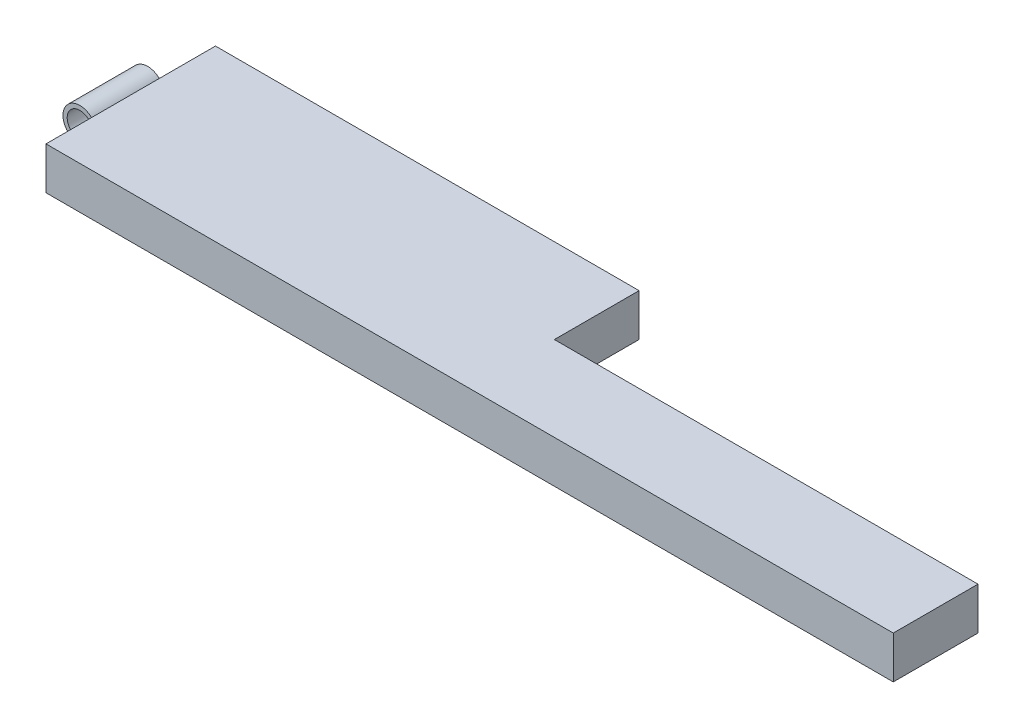
ISO-10303-21;
HEADER;
FILE_DESCRIPTION(('STEP AP214'),'2;1');
FILE_NAME('part.step','',(''),(''),'','','');
FILE_SCHEMA(('AUTOMOTIVE_DESIGN { 1 0 10303 214 1 1 1 1 }'));
ENDSEC;
DATA;
#1=APPLICATION_CONTEXT('core data for automotive mechanical design processes');
#2=APPLICATION_PROTOCOL_DEFINITION('international standard','automotive_design',2000,#1);
#3=PRODUCT_CONTEXT('',#1,'mechanical');
#4=PRODUCT('Part','Part','',(#3));
#5=PRODUCT_RELATED_PRODUCT_CATEGORY('part','',(#4));
#6=PRODUCT_DEFINITION_FORMATION('','',#4);
#7=PRODUCT_DEFINITION_CONTEXT('part definition',#1,'design');
#8=PRODUCT_DEFINITION('design','',#6,#7);
#9=PRODUCT_DEFINITION_SHAPE('','',#8);
#10=(LENGTH_UNIT() NAMED_UNIT(*) SI_UNIT(.MILLI.,.METRE.));
#11=(NAMED_UNIT(*) PLANE_ANGLE_UNIT() SI_UNIT($,.RADIAN.));
#12=(NAMED_UNIT(*) SI_UNIT($,.STERADIAN.) SOLID_ANGLE_UNIT());
#13=UNCERTAINTY_MEASURE_WITH_UNIT(LENGTH_MEASURE(1.E-05),#10,'distance_accuracy_value','');
#14=(GEOMETRIC_REPRESENTATION_CONTEXT(3) GLOBAL_UNCERTAINTY_ASSIGNED_CONTEXT((#13)) GLOBAL_UNIT_ASSIGNED_CONTEXT((#10,
#11,#12)) REPRESENTATION_CONTEXT('',''));
#15=CARTESIAN_POINT('',(0.,0.,0.));
#16=DIRECTION('',(0.,0.,1.));
#17=DIRECTION('',(1.,0.,0.));
#18=AXIS2_PLACEMENT_3D('',#15,#16,#17);
#19=CARTESIAN_POINT('',(-2.54,3.71258824663484,-17.78));
#20=DIRECTION('',(0.,0.,1.));
#21=DIRECTION('',(1.,0.,0.));
#22=AXIS2_PLACEMENT_3D('',#19,#20,#21);
#23=CYLINDRICAL_SURFACE('',#22,2.54);
#24=CARTESIAN_POINT('',(-2.54,3.71258824663484,-17.78));
#25=DIRECTION('',(0.,0.,1.));
#26=DIRECTION('',(1.,0.,0.));
#27=AXIS2_PLACEMENT_3D('',#24,#25,#26);
#28=CIRCLE('',#27,2.54);
#29=CARTESIAN_POINT('',(0.,3.71258824663484,-17.78));
#30=VERTEX_POINT('',#29);
#31=EDGE_CURVE('E11',#30,#30,#28,.T.);
#32=ORIENTED_EDGE('',*,*,#31,.T.);
#33=EDGE_LOOP('',(#32));
#34=FACE_BOUND('',#33,.T.);
#35=CARTESIAN_POINT('',(-2.54,3.71258824663484,-7.62));
#36=DIRECTION('',(0.,0.,1.));
#37=DIRECTION('',(1.,0.,0.));
#38=AXIS2_PLACEMENT_3D('',#35,#36,#37);
#39=CIRCLE('',#38,2.54);
#40=CARTESIAN_POINT('',(0.,3.71258824663484,-7.62));
#41=VERTEX_POINT('',#40);
#42=EDGE_CURVE('E51',#41,#41,#39,.T.);
#43=ORIENTED_EDGE('',*,*,#42,.F.);
#44=EDGE_LOOP('',(#43));
#45=FACE_BOUND('',#44,.T.);
#46=ADVANCED_FACE('F41',(#34,#45),#23,.T.);
#47=CARTESIAN_POINT('',(-2.54,3.71258824663484,-17.78));
#48=DIRECTION('',(0.,0.,1.));
#49=DIRECTION('',(1.,0.,0.));
#50=AXIS2_PLACEMENT_3D('',#47,#48,#49);
#51=PLANE('',#50);
#52=CARTESIAN_POINT('',(-2.54,3.71258824663484,-17.78));
#53=DIRECTION('',(0.,0.,1.));
#54=DIRECTION('',(1.,0.,0.));
#55=AXIS2_PLACEMENT_3D('',#52,#53,#54);
#56=CIRCLE('',#55,1.905);
#57=CARTESIAN_POINT('',(-0.635000000000001,3.71258824663484,-17.78));
#58=VERTEX_POINT('',#57);
#59=EDGE_CURVE('E47',#58,#58,#56,.T.);
#60=ORIENTED_EDGE('',*,*,#59,.T.);
#61=EDGE_LOOP('',(#60));
#62=FACE_BOUND('',#61,.T.);
#63=ORIENTED_EDGE('',*,*,#31,.F.);
#64=EDGE_LOOP('',(#63));
#65=FACE_BOUND('',#64,.T.);
#66=ADVANCED_FACE('F70',(#62,#65),#51,.F.);
#67=CARTESIAN_POINT('',(-2.54,3.71258824663484,-17.78));
#68=DIRECTION('',(0.,0.,1.));
#69=DIRECTION('',(1.,0.,0.));
#70=AXIS2_PLACEMENT_3D('',#67,#68,#69);
#71=CYLINDRICAL_SURFACE('',#70,1.905);
#72=ORIENTED_EDGE('',*,*,#59,.F.);
#73=EDGE_LOOP('',(#72));
#74=FACE_BOUND('',#73,.T.);
#75=CARTESIAN_POINT('',(-2.54,3.71258824663484,-7.62));
#76=DIRECTION('',(0.,0.,1.));
#77=DIRECTION('',(1.,0.,0.));
#78=AXIS2_PLACEMENT_3D('',#75,#76,#77);
#79=CIRCLE('',#78,1.905);
#80=CARTESIAN_POINT('',(-0.635000000000001,3.71258824663484,-7.62));
#81=VERTEX_POINT('',#80);
#82=EDGE_CURVE('E55',#81,#81,#79,.T.);
#83=ORIENTED_EDGE('',*,*,#82,.T.);
#84=EDGE_LOOP('',(#83));
#85=FACE_BOUND('',#84,.T.);
#86=ADVANCED_FACE('F61',(#74,#85),#71,.F.);
#87=CARTESIAN_POINT('',(-2.54,3.71258824663484,-7.62));
#88=DIRECTION('',(0.,0.,1.));
#89=DIRECTION('',(1.,0.,0.));
#90=AXIS2_PLACEMENT_3D('',#87,#88,#89);
#91=PLANE('',#90);
#92=ORIENTED_EDGE('',*,*,#42,.T.);
#93=EDGE_LOOP('',(#92));
#94=FACE_BOUND('',#93,.T.);
#95=ORIENTED_EDGE('',*,*,#82,.F.);
#96=EDGE_LOOP('',(#95));
#97=FACE_BOUND('',#96,.T.);
#98=ADVANCED_FACE('F63',(#94,#97),#91,.T.);
#99=CLOSED_SHELL('',(#46,#66,#86,#98));
#100=MANIFOLD_SOLID_BREP('B2',#99);
#101=CARTESIAN_POINT('',(0.,6.35,0.));
#102=DIRECTION('',(1.,0.,0.));
#103=DIRECTION('',(0.,0.,-1.));
#104=AXIS2_PLACEMENT_3D('',#101,#102,#103);
#105=PLANE('',#104);
#106=DIRECTION('',(0.,0.,1.));
#107=VECTOR('',#106,1.);
#108=CARTESIAN_POINT('',(0.,0.,0.));
#109=LINE('',#108,#107);
#110=CARTESIAN_POINT('',(0.,0.,-25.4));
#111=VERTEX_POINT('',#110);
#112=CARTESIAN_POINT('',(0.,0.,0.));
#113=VERTEX_POINT('',#112);
#114=EDGE_CURVE('E187',#111,#113,#109,.T.);
#115=ORIENTED_EDGE('',*,*,#114,.T.);
#116=DIRECTION('',(0.,-1.,0.));
#117=VECTOR('',#116,1.);
#118=CARTESIAN_POINT('',(0.,6.35,0.));
#119=LINE('',#118,#117);
#120=CARTESIAN_POINT('',(0.,6.35,0.));
#121=VERTEX_POINT('',#120);
#122=EDGE_CURVE('E39',#121,#113,#119,.T.);
#123=ORIENTED_EDGE('',*,*,#122,.F.);
#124=DIRECTION('',(0.,0.,1.));
#125=VECTOR('',#124,1.);
#126=CARTESIAN_POINT('',(0.,6.35,0.));
#127=LINE('',#126,#125);
#128=CARTESIAN_POINT('',(0.,6.35,-25.4));
#129=VERTEX_POINT('',#128);
#130=EDGE_CURVE('E197',#129,#121,#127,.T.);
#131=ORIENTED_EDGE('',*,*,#130,.F.);
#132=DIRECTION('',(0.,-1.,0.));
#133=VECTOR('',#132,1.);
#134=CARTESIAN_POINT('',(0.,6.35,-25.4));
#135=LINE('',#134,#133);
#136=EDGE_CURVE('E183',#129,#111,#135,.T.);
#137=ORIENTED_EDGE('',*,*,#136,.T.);
#138=EDGE_LOOP('',(#115,#123,#131,#137));
#139=FACE_BOUND('',#138,.T.);
#140=ADVANCED_FACE('F103',(#139),#105,.F.);
#141=CARTESIAN_POINT('',(0.,6.35,0.));
#142=DIRECTION('',(0.,0.,-1.));
#143=DIRECTION('',(-1.,0.,0.));
#144=AXIS2_PLACEMENT_3D('',#141,#142,#143);
#145=PLANE('',#144);
#146=DIRECTION('',(1.,0.,0.));
#147=VECTOR('',#146,1.);
#148=CARTESIAN_POINT('',(0.,0.,0.));
#149=LINE('',#148,#147);
#150=CARTESIAN_POINT('',(127.,0.,0.));
#151=VERTEX_POINT('',#150);
#152=EDGE_CURVE('E190',#113,#151,#149,.T.);
#153=ORIENTED_EDGE('',*,*,#152,.T.);
#154=DIRECTION('',(0.,-1.,0.));
#155=VECTOR('',#154,1.);
#156=CARTESIAN_POINT('',(127.,6.35,0.));
#157=LINE('',#156,#155);
#158=CARTESIAN_POINT('',(127.,6.35,0.));
#159=VERTEX_POINT('',#158);
#160=EDGE_CURVE('E111',#159,#151,#157,.T.);
#161=ORIENTED_EDGE('',*,*,#160,.F.);
#162=DIRECTION('',(1.,0.,0.));
#163=VECTOR('',#162,1.);
#164=CARTESIAN_POINT('',(0.,6.35,0.));
#165=LINE('',#164,#163);
#166=EDGE_CURVE('E156',#121,#159,#165,.T.);
#167=ORIENTED_EDGE('',*,*,#166,.F.);
#168=ORIENTED_EDGE('',*,*,#122,.T.);
#169=EDGE_LOOP('',(#153,#161,#167,#168));
#170=FACE_BOUND('',#169,.T.);
#171=ADVANCED_FACE('F221',(#170),#145,.F.);
#172=CARTESIAN_POINT('',(127.,6.35,0.));
#173=DIRECTION('',(-1.,0.,0.));
#174=DIRECTION('',(0.,0.,1.));
#175=AXIS2_PLACEMENT_3D('',#172,#173,#174);
#176=PLANE('',#175);
#177=DIRECTION('',(0.,0.,-1.));
#178=VECTOR('',#177,1.);
#179=CARTESIAN_POINT('',(127.,0.,0.));
#180=LINE('',#179,#178);
#181=CARTESIAN_POINT('',(127.,0.,-12.7));
#182=VERTEX_POINT('',#181);
#183=EDGE_CURVE('E192',#151,#182,#180,.T.);
#184=ORIENTED_EDGE('',*,*,#183,.T.);
#185=DIRECTION('',(0.,-1.,0.));
#186=VECTOR('',#185,1.);
#187=CARTESIAN_POINT('',(127.,6.35,-12.7));
#188=LINE('',#187,#186);
#189=CARTESIAN_POINT('',(127.,6.35,-12.7));
#190=VERTEX_POINT('',#189);
#191=EDGE_CURVE('E178',#190,#182,#188,.T.);
#192=ORIENTED_EDGE('',*,*,#191,.F.);
#193=DIRECTION('',(0.,0.,-1.));
#194=VECTOR('',#193,1.);
#195=CARTESIAN_POINT('',(127.,6.35,0.));
#196=LINE('',#195,#194);
#197=EDGE_CURVE('E169',#159,#190,#196,.T.);
#198=ORIENTED_EDGE('',*,*,#197,.F.);
#199=ORIENTED_EDGE('',*,*,#160,.T.);
#200=EDGE_LOOP('',(#184,#192,#198,#199));
#201=FACE_BOUND('',#200,.T.);
#202=ADVANCED_FACE('F203',(#201),#176,.F.);
#203=CARTESIAN_POINT('',(63.5,6.35,-12.7));
#204=DIRECTION('',(0.,0.,1.));
#205=DIRECTION('',(1.,0.,0.));
#206=AXIS2_PLACEMENT_3D('',#203,#204,#205);
#207=PLANE('',#206);
#208=DIRECTION('',(-1.,0.,0.));
#209=VECTOR('',#208,1.);
#210=CARTESIAN_POINT('',(63.5,0.,-12.7));
#211=LINE('',#210,#209);
#212=CARTESIAN_POINT('',(63.5,0.,-12.7));
#213=VERTEX_POINT('',#212);
#214=EDGE_CURVE('E177',#182,#213,#211,.T.);
#215=ORIENTED_EDGE('',*,*,#214,.T.);
#216=DIRECTION('',(0.,-1.,0.));
#217=VECTOR('',#216,1.);
#218=CARTESIAN_POINT('',(63.5,6.35,-12.7));
#219=LINE('',#218,#217);
#220=CARTESIAN_POINT('',(63.5,6.35,-12.7));
#221=VERTEX_POINT('',#220);
#222=EDGE_CURVE('E174',#221,#213,#219,.T.);
#223=ORIENTED_EDGE('',*,*,#222,.F.);
#224=DIRECTION('',(-1.,0.,0.));
#225=VECTOR('',#224,1.);
#226=CARTESIAN_POINT('',(63.5,6.35,-12.7));
#227=LINE('',#226,#225);
#228=EDGE_CURVE('E163',#190,#221,#227,.T.);
#229=ORIENTED_EDGE('',*,*,#228,.F.);
#230=ORIENTED_EDGE('',*,*,#191,.T.);
#231=EDGE_LOOP('',(#215,#223,#229,#230));
#232=FACE_BOUND('',#231,.T.);
#233=ADVANCED_FACE('F175',(#232),#207,.F.);
#234=CARTESIAN_POINT('',(63.5,6.35,-25.4));
#235=DIRECTION('',(-1.,0.,0.));
#236=DIRECTION('',(0.,0.,1.));
#237=AXIS2_PLACEMENT_3D('',#234,#235,#236);
#238=PLANE('',#237);
#239=DIRECTION('',(0.,0.,-1.));
#240=VECTOR('',#239,1.);
#241=CARTESIAN_POINT('',(63.5,0.,-25.4));
#242=LINE('',#241,#240);
#243=CARTESIAN_POINT('',(63.5,0.,-25.4));
#244=VERTEX_POINT('',#243);
#245=EDGE_CURVE('E142',#213,#244,#242,.T.);
#246=ORIENTED_EDGE('',*,*,#245,.T.);
#247=DIRECTION('',(0.,-1.,0.));
#248=VECTOR('',#247,1.);
#249=CARTESIAN_POINT('',(63.5,6.35,-25.4));
#250=LINE('',#249,#248);
#251=CARTESIAN_POINT('',(63.5,6.35,-25.4));
#252=VERTEX_POINT('',#251);
#253=EDGE_CURVE('E179',#252,#244,#250,.T.);
#254=ORIENTED_EDGE('',*,*,#253,.F.);
#255=DIRECTION('',(0.,0.,-1.));
#256=VECTOR('',#255,1.);
#257=CARTESIAN_POINT('',(63.5,6.35,-25.4));
#258=LINE('',#257,#256);
#259=EDGE_CURVE('E167',#221,#252,#258,.T.);
#260=ORIENTED_EDGE('',*,*,#259,.F.);
#261=ORIENTED_EDGE('',*,*,#222,.T.);
#262=EDGE_LOOP('',(#246,#254,#260,#261));
#263=FACE_BOUND('',#262,.T.);
#264=ADVANCED_FACE('F181',(#263),#238,.F.);
#265=CARTESIAN_POINT('',(0.,6.35,-25.4));
#266=DIRECTION('',(0.,0.,1.));
#267=DIRECTION('',(1.,0.,0.));
#268=AXIS2_PLACEMENT_3D('',#265,#266,#267);
#269=PLANE('',#268);
#270=DIRECTION('',(-1.,0.,0.));
#271=VECTOR('',#270,1.);
#272=CARTESIAN_POINT('',(0.,0.,-25.4));
#273=LINE('',#272,#271);
#274=EDGE_CURVE('E148',#244,#111,#273,.T.);
#275=ORIENTED_EDGE('',*,*,#274,.T.);
#276=ORIENTED_EDGE('',*,*,#136,.F.);
#277=DIRECTION('',(-1.,0.,0.));
#278=VECTOR('',#277,1.);
#279=CARTESIAN_POINT('',(0.,6.35,-25.4));
#280=LINE('',#279,#278);
#281=EDGE_CURVE('E119',#252,#129,#280,.T.);
#282=ORIENTED_EDGE('',*,*,#281,.F.);
#283=ORIENTED_EDGE('',*,*,#253,.T.);
#284=EDGE_LOOP('',(#275,#276,#282,#283));
#285=FACE_BOUND('',#284,.T.);
#286=ADVANCED_FACE('F210',(#285),#269,.F.);
#287=CARTESIAN_POINT('',(0.,6.35,0.));
#288=DIRECTION('',(0.,-1.,0.));
#289=DIRECTION('',(0.,0.,-1.));
#290=AXIS2_PLACEMENT_3D('',#287,#288,#289);
#291=PLANE('',#290);
#292=ORIENTED_EDGE('',*,*,#130,.T.);
#293=ORIENTED_EDGE('',*,*,#166,.T.);
#294=ORIENTED_EDGE('',*,*,#197,.T.);
#295=ORIENTED_EDGE('',*,*,#228,.T.);
#296=ORIENTED_EDGE('',*,*,#259,.T.);
#297=ORIENTED_EDGE('',*,*,#281,.T.);
#298=EDGE_LOOP('',(#292,#293,#294,#295,#296,#297));
#299=FACE_BOUND('',#298,.T.);
#300=ADVANCED_FACE('F165',(#299),#291,.F.);
#301=CARTESIAN_POINT('',(0.,0.,0.));
#302=DIRECTION('',(0.,-1.,0.));
#303=DIRECTION('',(0.,0.,-1.));
#304=AXIS2_PLACEMENT_3D('',#301,#302,#303);
#305=PLANE('',#304);
#306=ORIENTED_EDGE('',*,*,#114,.F.);
#307=ORIENTED_EDGE('',*,*,#274,.F.);
#308=ORIENTED_EDGE('',*,*,#245,.F.);
#309=ORIENTED_EDGE('',*,*,#214,.F.);
#310=ORIENTED_EDGE('',*,*,#183,.F.);
#311=ORIENTED_EDGE('',*,*,#152,.F.);
#312=EDGE_LOOP('',(#306,#307,#308,#309,#310,#311));
#313=FACE_BOUND('',#312,.T.);
#314=ADVANCED_FACE('F206',(#313),#305,.T.);
#315=CLOSED_SHELL('',(#140,#171,#202,#233,#264,#286,#300,#314));
#316=MANIFOLD_SOLID_BREP('B6',#315);
#317=ADVANCED_BREP_SHAPE_REPRESENTATION('',(#18,#100,#316),#14);
#318=SHAPE_DEFINITION_REPRESENTATION(#9,#317);
ENDSEC;
END-ISO-10303-21;
